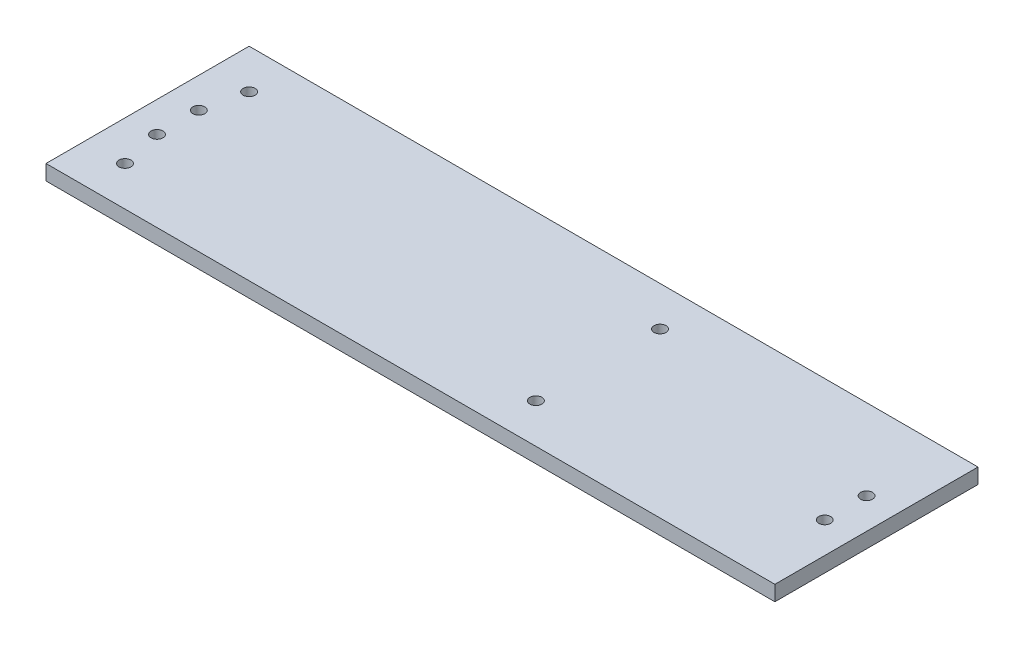
ISO-10303-21;
HEADER;
FILE_DESCRIPTION(('STEP AP214'),'2;1');
FILE_NAME('part.step','',(''),(''),'','','');
FILE_SCHEMA(('AUTOMOTIVE_DESIGN { 1 0 10303 214 1 1 1 1 }'));
ENDSEC;
DATA;
#1=APPLICATION_CONTEXT('core data for automotive mechanical design processes');
#2=APPLICATION_PROTOCOL_DEFINITION('international standard','automotive_design',2000,#1);
#3=PRODUCT_CONTEXT('',#1,'mechanical');
#4=PRODUCT('Part','Part','',(#3));
#5=PRODUCT_RELATED_PRODUCT_CATEGORY('part','',(#4));
#6=PRODUCT_DEFINITION_FORMATION('','',#4);
#7=PRODUCT_DEFINITION_CONTEXT('part definition',#1,'design');
#8=PRODUCT_DEFINITION('design','',#6,#7);
#9=PRODUCT_DEFINITION_SHAPE('','',#8);
#10=(LENGTH_UNIT() NAMED_UNIT(*) SI_UNIT(.MILLI.,.METRE.));
#11=(NAMED_UNIT(*) PLANE_ANGLE_UNIT() SI_UNIT($,.RADIAN.));
#12=(NAMED_UNIT(*) SI_UNIT($,.STERADIAN.) SOLID_ANGLE_UNIT());
#13=UNCERTAINTY_MEASURE_WITH_UNIT(LENGTH_MEASURE(1.E-05),#10,'distance_accuracy_value','');
#14=(GEOMETRIC_REPRESENTATION_CONTEXT(3) GLOBAL_UNCERTAINTY_ASSIGNED_CONTEXT((#13)) GLOBAL_UNIT_ASSIGNED_CONTEXT((#10,
#11,#12)) REPRESENTATION_CONTEXT('',''));
#15=CARTESIAN_POINT('',(0.,0.,0.));
#16=DIRECTION('',(0.,0.,1.));
#17=DIRECTION('',(1.,0.,0.));
#18=AXIS2_PLACEMENT_3D('',#15,#16,#17);
#19=CARTESIAN_POINT('',(152.5,3.175,42.5));
#20=DIRECTION('',(-1.,0.,0.));
#21=DIRECTION('',(0.,0.,1.));
#22=AXIS2_PLACEMENT_3D('',#19,#20,#21);
#23=PLANE('',#22);
#24=DIRECTION('',(0.,0.,-1.));
#25=VECTOR('',#24,1.);
#26=CARTESIAN_POINT('',(152.5,-3.175,42.5));
#27=LINE('',#26,#25);
#28=CARTESIAN_POINT('',(152.5,-3.175,42.5));
#29=VERTEX_POINT('',#28);
#30=CARTESIAN_POINT('',(152.5,-3.175,-42.5));
#31=VERTEX_POINT('',#30);
#32=EDGE_CURVE('E104',#29,#31,#27,.T.);
#33=ORIENTED_EDGE('',*,*,#32,.T.);
#34=DIRECTION('',(0.,-1.,0.));
#35=VECTOR('',#34,1.);
#36=CARTESIAN_POINT('',(152.5,3.175,-42.5));
#37=LINE('',#36,#35);
#38=CARTESIAN_POINT('',(152.5,3.175,-42.5));
#39=VERTEX_POINT('',#38);
#40=EDGE_CURVE('E11',#39,#31,#37,.T.);
#41=ORIENTED_EDGE('',*,*,#40,.F.);
#42=DIRECTION('',(0.,0.,-1.));
#43=VECTOR('',#42,1.);
#44=CARTESIAN_POINT('',(152.5,3.175,42.5));
#45=LINE('',#44,#43);
#46=CARTESIAN_POINT('',(152.5,3.175,42.5));
#47=VERTEX_POINT('',#46);
#48=EDGE_CURVE('E91',#47,#39,#45,.T.);
#49=ORIENTED_EDGE('',*,*,#48,.F.);
#50=DIRECTION('',(0.,-1.,0.));
#51=VECTOR('',#50,1.);
#52=CARTESIAN_POINT('',(152.5,3.175,42.5));
#53=LINE('',#52,#51);
#54=EDGE_CURVE('E100',#47,#29,#53,.T.);
#55=ORIENTED_EDGE('',*,*,#54,.T.);
#56=EDGE_LOOP('',(#33,#41,#49,#55));
#57=FACE_BOUND('',#56,.T.);
#58=ADVANCED_FACE('F38',(#57),#23,.F.);
#59=CARTESIAN_POINT('',(-152.5,3.175,-42.5));
#60=DIRECTION('',(0.,0.,1.));
#61=DIRECTION('',(1.,0.,0.));
#62=AXIS2_PLACEMENT_3D('',#59,#60,#61);
#63=PLANE('',#62);
#64=DIRECTION('',(-1.,0.,0.));
#65=VECTOR('',#64,1.);
#66=CARTESIAN_POINT('',(-152.5,-3.175,-42.5));
#67=LINE('',#66,#65);
#68=CARTESIAN_POINT('',(-152.5,-3.175,-42.5));
#69=VERTEX_POINT('',#68);
#70=EDGE_CURVE('E95',#31,#69,#67,.T.);
#71=ORIENTED_EDGE('',*,*,#70,.T.);
#72=DIRECTION('',(0.,-1.,0.));
#73=VECTOR('',#72,1.);
#74=CARTESIAN_POINT('',(-152.5,3.175,-42.5));
#75=LINE('',#74,#73);
#76=CARTESIAN_POINT('',(-152.5,3.175,-42.5));
#77=VERTEX_POINT('',#76);
#78=EDGE_CURVE('E47',#77,#69,#75,.T.);
#79=ORIENTED_EDGE('',*,*,#78,.F.);
#80=DIRECTION('',(-1.,0.,0.));
#81=VECTOR('',#80,1.);
#82=CARTESIAN_POINT('',(-152.5,3.175,-42.5));
#83=LINE('',#82,#81);
#84=EDGE_CURVE('E86',#39,#77,#83,.T.);
#85=ORIENTED_EDGE('',*,*,#84,.F.);
#86=ORIENTED_EDGE('',*,*,#40,.T.);
#87=EDGE_LOOP('',(#71,#79,#85,#86));
#88=FACE_BOUND('',#87,.T.);
#89=ADVANCED_FACE('F94',(#88),#63,.F.);
#90=CARTESIAN_POINT('',(-152.5,3.175,42.5));
#91=DIRECTION('',(1.,0.,0.));
#92=DIRECTION('',(0.,0.,-1.));
#93=AXIS2_PLACEMENT_3D('',#90,#91,#92);
#94=PLANE('',#93);
#95=DIRECTION('',(0.,0.,1.));
#96=VECTOR('',#95,1.);
#97=CARTESIAN_POINT('',(-152.5,-3.175,42.5));
#98=LINE('',#97,#96);
#99=CARTESIAN_POINT('',(-152.5,-3.175,42.5));
#100=VERTEX_POINT('',#99);
#101=EDGE_CURVE('E73',#69,#100,#98,.T.);
#102=ORIENTED_EDGE('',*,*,#101,.T.);
#103=DIRECTION('',(0.,-1.,0.));
#104=VECTOR('',#103,1.);
#105=CARTESIAN_POINT('',(-152.5,3.175,42.5));
#106=LINE('',#105,#104);
#107=CARTESIAN_POINT('',(-152.5,3.175,42.5));
#108=VERTEX_POINT('',#107);
#109=EDGE_CURVE('E96',#108,#100,#106,.T.);
#110=ORIENTED_EDGE('',*,*,#109,.F.);
#111=DIRECTION('',(0.,0.,1.));
#112=VECTOR('',#111,1.);
#113=CARTESIAN_POINT('',(-152.5,3.175,42.5));
#114=LINE('',#113,#112);
#115=EDGE_CURVE('E89',#77,#108,#114,.T.);
#116=ORIENTED_EDGE('',*,*,#115,.F.);
#117=ORIENTED_EDGE('',*,*,#78,.T.);
#118=EDGE_LOOP('',(#102,#110,#116,#117));
#119=FACE_BOUND('',#118,.T.);
#120=ADVANCED_FACE('F98',(#119),#94,.F.);
#121=CARTESIAN_POINT('',(-152.5,3.175,42.5));
#122=DIRECTION('',(0.,0.,-1.));
#123=DIRECTION('',(-1.,0.,0.));
#124=AXIS2_PLACEMENT_3D('',#121,#122,#123);
#125=PLANE('',#124);
#126=DIRECTION('',(1.,0.,0.));
#127=VECTOR('',#126,1.);
#128=CARTESIAN_POINT('',(-152.5,-3.175,42.5));
#129=LINE('',#128,#127);
#130=EDGE_CURVE('E79',#100,#29,#129,.T.);
#131=ORIENTED_EDGE('',*,*,#130,.T.);
#132=ORIENTED_EDGE('',*,*,#54,.F.);
#133=DIRECTION('',(1.,0.,0.));
#134=VECTOR('',#133,1.);
#135=CARTESIAN_POINT('',(-152.5,3.175,42.5));
#136=LINE('',#135,#134);
#137=EDGE_CURVE('E56',#108,#47,#136,.T.);
#138=ORIENTED_EDGE('',*,*,#137,.F.);
#139=ORIENTED_EDGE('',*,*,#109,.T.);
#140=EDGE_LOOP('',(#131,#132,#138,#139));
#141=FACE_BOUND('',#140,.T.);
#142=ADVANCED_FACE('F177',(#141),#125,.F.);
#143=CARTESIAN_POINT('',(0.,3.175,0.));
#144=DIRECTION('',(0.,-1.,0.));
#145=DIRECTION('',(0.,0.,-1.));
#146=AXIS2_PLACEMENT_3D('',#143,#144,#145);
#147=PLANE('',#146);
#148=CARTESIAN_POINT('',(139.600000000001,3.175,-8.74999999999215));
#149=DIRECTION('',(0.,-1.,0.));
#150=DIRECTION('',(0.,0.,-1.));
#151=AXIS2_PLACEMENT_3D('',#148,#149,#150);
#152=CIRCLE('',#151,2.49999999999789);
#153=CARTESIAN_POINT('',(139.600000000001,3.175,-11.24999999999));
#154=VERTEX_POINT('',#153);
#155=EDGE_CURVE('E114',#154,#154,#152,.T.);
#156=ORIENTED_EDGE('',*,*,#155,.T.);
#157=EDGE_LOOP('',(#156));
#158=FACE_BOUND('',#157,.T.);
#159=CARTESIAN_POINT('',(139.600000000001,3.175,8.75000000000787));
#160=DIRECTION('',(0.,-1.,0.));
#161=DIRECTION('',(0.,0.,-1.));
#162=AXIS2_PLACEMENT_3D('',#159,#160,#161);
#163=CIRCLE('',#162,2.49999999999789);
#164=CARTESIAN_POINT('',(139.600000000001,3.175,6.25000000000998));
#165=VERTEX_POINT('',#164);
#166=EDGE_CURVE('E120',#165,#165,#163,.T.);
#167=ORIENTED_EDGE('',*,*,#166,.T.);
#168=EDGE_LOOP('',(#167));
#169=FACE_BOUND('',#168,.T.);
#170=CARTESIAN_POINT('',(-139.8,3.175,-8.75));
#171=DIRECTION('',(0.,-1.,0.));
#172=DIRECTION('',(0.,0.,-1.));
#173=AXIS2_PLACEMENT_3D('',#170,#171,#172);
#174=CIRCLE('',#173,2.5);
#175=CARTESIAN_POINT('',(-139.8,3.175,-11.25));
#176=VERTEX_POINT('',#175);
#177=EDGE_CURVE('E135',#176,#176,#174,.T.);
#178=ORIENTED_EDGE('',*,*,#177,.T.);
#179=EDGE_LOOP('',(#178));
#180=FACE_BOUND('',#179,.T.);
#181=CARTESIAN_POINT('',(-139.8,3.175,8.75));
#182=DIRECTION('',(0.,-1.,0.));
#183=DIRECTION('',(0.,0.,-1.));
#184=AXIS2_PLACEMENT_3D('',#181,#182,#183);
#185=CIRCLE('',#184,2.5);
#186=CARTESIAN_POINT('',(-139.8,3.175,6.25));
#187=VERTEX_POINT('',#186);
#188=EDGE_CURVE('E130',#187,#187,#185,.T.);
#189=ORIENTED_EDGE('',*,*,#188,.T.);
#190=EDGE_LOOP('',(#189));
#191=FACE_BOUND('',#190,.T.);
#192=CARTESIAN_POINT('',(35.98,3.175,25.98));
#193=DIRECTION('',(0.,1.,0.));
#194=DIRECTION('',(0.,0.,-1.));
#195=AXIS2_PLACEMENT_3D('',#192,#193,#194);
#196=CIRCLE('',#195,2.50000000000011);
#197=CARTESIAN_POINT('',(35.98,3.175,23.4799999999999));
#198=VERTEX_POINT('',#197);
#199=EDGE_CURVE('E142',#198,#198,#196,.T.);
#200=ORIENTED_EDGE('',*,*,#199,.F.);
#201=EDGE_LOOP('',(#200));
#202=FACE_BOUND('',#201,.T.);
#203=CARTESIAN_POINT('',(35.98,3.175,-25.98));
#204=DIRECTION('',(0.,1.,0.));
#205=DIRECTION('',(0.,0.,1.));
#206=AXIS2_PLACEMENT_3D('',#203,#204,#205);
#207=CIRCLE('',#206,2.50000000000011);
#208=CARTESIAN_POINT('',(35.98,3.175,-23.4799999999999));
#209=VERTEX_POINT('',#208);
#210=EDGE_CURVE('E143',#209,#209,#207,.T.);
#211=ORIENTED_EDGE('',*,*,#210,.F.);
#212=EDGE_LOOP('',(#211));
#213=FACE_BOUND('',#212,.T.);
#214=CARTESIAN_POINT('',(-135.98,3.175,25.98));
#215=DIRECTION('',(0.,-1.,0.));
#216=DIRECTION('',(0.,0.,-1.));
#217=AXIS2_PLACEMENT_3D('',#214,#215,#216);
#218=CIRCLE('',#217,2.50000000000011);
#219=CARTESIAN_POINT('',(-135.98,3.175,23.4799999999999));
#220=VERTEX_POINT('',#219);
#221=EDGE_CURVE('E107',#220,#220,#218,.T.);
#222=ORIENTED_EDGE('',*,*,#221,.T.);
#223=EDGE_LOOP('',(#222));
#224=FACE_BOUND('',#223,.T.);
#225=CARTESIAN_POINT('',(-135.98,3.175,-25.98));
#226=DIRECTION('',(0.,-1.,0.));
#227=DIRECTION('',(0.,0.,1.));
#228=AXIS2_PLACEMENT_3D('',#225,#226,#227);
#229=CIRCLE('',#228,2.50000000000011);
#230=CARTESIAN_POINT('',(-135.98,3.175,-23.4799999999999));
#231=VERTEX_POINT('',#230);
#232=EDGE_CURVE('E154',#231,#231,#229,.T.);
#233=ORIENTED_EDGE('',*,*,#232,.T.);
#234=EDGE_LOOP('',(#233));
#235=FACE_BOUND('',#234,.T.);
#236=ORIENTED_EDGE('',*,*,#48,.T.);
#237=ORIENTED_EDGE('',*,*,#84,.T.);
#238=ORIENTED_EDGE('',*,*,#115,.T.);
#239=ORIENTED_EDGE('',*,*,#137,.T.);
#240=EDGE_LOOP('',(#236,#237,#238,#239));
#241=FACE_BOUND('',#240,.T.);
#242=ADVANCED_FACE('F87',(#158,#169,#180,#191,#202,#213,#224,#235,#241),#147,.F.);
#243=CARTESIAN_POINT('',(0.,-3.175,0.));
#244=DIRECTION('',(0.,-1.,0.));
#245=DIRECTION('',(0.,0.,-1.));
#246=AXIS2_PLACEMENT_3D('',#243,#244,#245);
#247=PLANE('',#246);
#248=CARTESIAN_POINT('',(139.600000000001,-3.175,-8.74999999999215));
#249=DIRECTION('',(0.,-1.,0.));
#250=DIRECTION('',(0.,0.,-1.));
#251=AXIS2_PLACEMENT_3D('',#248,#249,#250);
#252=CIRCLE('',#251,2.49999999999789);
#253=CARTESIAN_POINT('',(139.600000000001,-3.175,-11.24999999999));
#254=VERTEX_POINT('',#253);
#255=EDGE_CURVE('E41',#254,#254,#252,.T.);
#256=ORIENTED_EDGE('',*,*,#255,.F.);
#257=EDGE_LOOP('',(#256));
#258=FACE_BOUND('',#257,.T.);
#259=CARTESIAN_POINT('',(139.600000000001,-3.175,8.75000000000787));
#260=DIRECTION('',(0.,-1.,0.));
#261=DIRECTION('',(0.,0.,-1.));
#262=AXIS2_PLACEMENT_3D('',#259,#260,#261);
#263=CIRCLE('',#262,2.49999999999789);
#264=CARTESIAN_POINT('',(139.600000000001,-3.175,6.25000000000998));
#265=VERTEX_POINT('',#264);
#266=EDGE_CURVE('E112',#265,#265,#263,.T.);
#267=ORIENTED_EDGE('',*,*,#266,.F.);
#268=EDGE_LOOP('',(#267));
#269=FACE_BOUND('',#268,.T.);
#270=CARTESIAN_POINT('',(-139.8,-3.175,-8.75));
#271=DIRECTION('',(0.,1.,0.));
#272=DIRECTION('',(0.,0.,1.));
#273=AXIS2_PLACEMENT_3D('',#270,#271,#272);
#274=CIRCLE('',#273,2.5);
#275=CARTESIAN_POINT('',(-139.8,-3.175,-6.25000000000001));
#276=VERTEX_POINT('',#275);
#277=EDGE_CURVE('E127',#276,#276,#274,.T.);
#278=ORIENTED_EDGE('',*,*,#277,.T.);
#279=EDGE_LOOP('',(#278));
#280=FACE_BOUND('',#279,.T.);
#281=CARTESIAN_POINT('',(-139.8,-3.175,8.75));
#282=DIRECTION('',(0.,1.,0.));
#283=DIRECTION('',(0.,0.,1.));
#284=AXIS2_PLACEMENT_3D('',#281,#282,#283);
#285=CIRCLE('',#284,2.5);
#286=CARTESIAN_POINT('',(-139.8,-3.175,11.25));
#287=VERTEX_POINT('',#286);
#288=EDGE_CURVE('E118',#287,#287,#285,.T.);
#289=ORIENTED_EDGE('',*,*,#288,.T.);
#290=EDGE_LOOP('',(#289));
#291=FACE_BOUND('',#290,.T.);
#292=CARTESIAN_POINT('',(35.98,-3.175,25.98));
#293=DIRECTION('',(0.,1.,0.));
#294=DIRECTION('',(0.,0.,-1.));
#295=AXIS2_PLACEMENT_3D('',#292,#293,#294);
#296=CIRCLE('',#295,2.50000000000011);
#297=CARTESIAN_POINT('',(35.98,-3.175,23.4799999999999));
#298=VERTEX_POINT('',#297);
#299=EDGE_CURVE('E139',#298,#298,#296,.T.);
#300=ORIENTED_EDGE('',*,*,#299,.T.);
#301=EDGE_LOOP('',(#300));
#302=FACE_BOUND('',#301,.T.);
#303=CARTESIAN_POINT('',(35.98,-3.175,-25.98));
#304=DIRECTION('',(0.,1.,0.));
#305=DIRECTION('',(0.,0.,1.));
#306=AXIS2_PLACEMENT_3D('',#303,#304,#305);
#307=CIRCLE('',#306,2.50000000000011);
#308=CARTESIAN_POINT('',(35.98,-3.175,-23.4799999999999));
#309=VERTEX_POINT('',#308);
#310=EDGE_CURVE('E138',#309,#309,#307,.T.);
#311=ORIENTED_EDGE('',*,*,#310,.T.);
#312=EDGE_LOOP('',(#311));
#313=FACE_BOUND('',#312,.T.);
#314=CARTESIAN_POINT('',(-135.98,-3.175,25.98));
#315=DIRECTION('',(0.,-1.,0.));
#316=DIRECTION('',(0.,0.,-1.));
#317=AXIS2_PLACEMENT_3D('',#314,#315,#316);
#318=CIRCLE('',#317,2.50000000000011);
#319=CARTESIAN_POINT('',(-135.98,-3.175,23.4799999999999));
#320=VERTEX_POINT('',#319);
#321=EDGE_CURVE('E151',#320,#320,#318,.T.);
#322=ORIENTED_EDGE('',*,*,#321,.F.);
#323=EDGE_LOOP('',(#322));
#324=FACE_BOUND('',#323,.T.);
#325=CARTESIAN_POINT('',(-135.98,-3.175,-25.98));
#326=DIRECTION('',(0.,-1.,0.));
#327=DIRECTION('',(0.,0.,1.));
#328=AXIS2_PLACEMENT_3D('',#325,#326,#327);
#329=CIRCLE('',#328,2.50000000000011);
#330=CARTESIAN_POINT('',(-135.98,-3.175,-23.4799999999999));
#331=VERTEX_POINT('',#330);
#332=EDGE_CURVE('E146',#331,#331,#329,.T.);
#333=ORIENTED_EDGE('',*,*,#332,.F.);
#334=EDGE_LOOP('',(#333));
#335=FACE_BOUND('',#334,.T.);
#336=ORIENTED_EDGE('',*,*,#32,.F.);
#337=ORIENTED_EDGE('',*,*,#130,.F.);
#338=ORIENTED_EDGE('',*,*,#101,.F.);
#339=ORIENTED_EDGE('',*,*,#70,.F.);
#340=EDGE_LOOP('',(#336,#337,#338,#339));
#341=FACE_BOUND('',#340,.T.);
#342=ADVANCED_FACE('F167',(#258,#269,#280,#291,#302,#313,#324,#335,#341),#247,.T.);
#343=CARTESIAN_POINT('',(-135.98,3.175,-25.98));
#344=DIRECTION('',(0.,-1.,0.));
#345=DIRECTION('',(0.,0.,-1.));
#346=AXIS2_PLACEMENT_3D('',#343,#344,#345);
#347=CYLINDRICAL_SURFACE('',#346,2.50000000000011);
#348=ORIENTED_EDGE('',*,*,#232,.F.);
#349=EDGE_LOOP('',(#348));
#350=FACE_BOUND('',#349,.T.);
#351=ORIENTED_EDGE('',*,*,#332,.T.);
#352=EDGE_LOOP('',(#351));
#353=FACE_BOUND('',#352,.T.);
#354=ADVANCED_FACE('F163',(#350,#353),#347,.F.);
#355=CARTESIAN_POINT('',(-135.98,3.175,25.98));
#356=DIRECTION('',(0.,-1.,0.));
#357=DIRECTION('',(0.,0.,-1.));
#358=AXIS2_PLACEMENT_3D('',#355,#356,#357);
#359=CYLINDRICAL_SURFACE('',#358,2.50000000000011);
#360=ORIENTED_EDGE('',*,*,#221,.F.);
#361=EDGE_LOOP('',(#360));
#362=FACE_BOUND('',#361,.T.);
#363=ORIENTED_EDGE('',*,*,#321,.T.);
#364=EDGE_LOOP('',(#363));
#365=FACE_BOUND('',#364,.T.);
#366=ADVANCED_FACE('F166',(#362,#365),#359,.F.);
#367=CARTESIAN_POINT('',(35.98,3.175,-25.98));
#368=DIRECTION('',(0.,-1.,0.));
#369=DIRECTION('',(0.,0.,-1.));
#370=AXIS2_PLACEMENT_3D('',#367,#368,#369);
#371=CYLINDRICAL_SURFACE('',#370,2.50000000000011);
#372=ORIENTED_EDGE('',*,*,#210,.T.);
#373=EDGE_LOOP('',(#372));
#374=FACE_BOUND('',#373,.T.);
#375=ORIENTED_EDGE('',*,*,#310,.F.);
#376=EDGE_LOOP('',(#375));
#377=FACE_BOUND('',#376,.T.);
#378=ADVANCED_FACE('F217',(#374,#377),#371,.F.);
#379=CARTESIAN_POINT('',(35.98,3.175,25.98));
#380=DIRECTION('',(0.,-1.,0.));
#381=DIRECTION('',(0.,0.,-1.));
#382=AXIS2_PLACEMENT_3D('',#379,#380,#381);
#383=CYLINDRICAL_SURFACE('',#382,2.50000000000011);
#384=ORIENTED_EDGE('',*,*,#199,.T.);
#385=EDGE_LOOP('',(#384));
#386=FACE_BOUND('',#385,.T.);
#387=ORIENTED_EDGE('',*,*,#299,.F.);
#388=EDGE_LOOP('',(#387));
#389=FACE_BOUND('',#388,.T.);
#390=ADVANCED_FACE('F228',(#386,#389),#383,.F.);
#391=CARTESIAN_POINT('',(-139.8,-3.175,8.75));
#392=DIRECTION('',(0.,1.,0.));
#393=DIRECTION('',(0.,0.,1.));
#394=AXIS2_PLACEMENT_3D('',#391,#392,#393);
#395=CYLINDRICAL_SURFACE('',#394,2.5);
#396=ORIENTED_EDGE('',*,*,#288,.F.);
#397=EDGE_LOOP('',(#396));
#398=FACE_BOUND('',#397,.T.);
#399=ORIENTED_EDGE('',*,*,#188,.F.);
#400=EDGE_LOOP('',(#399));
#401=FACE_BOUND('',#400,.T.);
#402=ADVANCED_FACE('F239',(#398,#401),#395,.F.);
#403=CARTESIAN_POINT('',(-139.8,-3.175,-8.75));
#404=DIRECTION('',(0.,1.,0.));
#405=DIRECTION('',(0.,0.,1.));
#406=AXIS2_PLACEMENT_3D('',#403,#404,#405);
#407=CYLINDRICAL_SURFACE('',#406,2.5);
#408=ORIENTED_EDGE('',*,*,#277,.F.);
#409=EDGE_LOOP('',(#408));
#410=FACE_BOUND('',#409,.T.);
#411=ORIENTED_EDGE('',*,*,#177,.F.);
#412=EDGE_LOOP('',(#411));
#413=FACE_BOUND('',#412,.T.);
#414=ADVANCED_FACE('F250',(#410,#413),#407,.F.);
#415=CARTESIAN_POINT('',(139.600000000001,3.175,8.75000000000787));
#416=DIRECTION('',(0.,-1.,0.));
#417=DIRECTION('',(0.,0.,-1.));
#418=AXIS2_PLACEMENT_3D('',#415,#416,#417);
#419=CYLINDRICAL_SURFACE('',#418,2.49999999999789);
#420=ORIENTED_EDGE('',*,*,#266,.T.);
#421=EDGE_LOOP('',(#420));
#422=FACE_BOUND('',#421,.T.);
#423=ORIENTED_EDGE('',*,*,#166,.F.);
#424=EDGE_LOOP('',(#423));
#425=FACE_BOUND('',#424,.T.);
#426=ADVANCED_FACE('F260',(#422,#425),#419,.F.);
#427=CARTESIAN_POINT('',(139.600000000001,3.175,-8.74999999999215));
#428=DIRECTION('',(0.,-1.,0.));
#429=DIRECTION('',(0.,0.,-1.));
#430=AXIS2_PLACEMENT_3D('',#427,#428,#429);
#431=CYLINDRICAL_SURFACE('',#430,2.49999999999789);
#432=ORIENTED_EDGE('',*,*,#255,.T.);
#433=EDGE_LOOP('',(#432));
#434=FACE_BOUND('',#433,.T.);
#435=ORIENTED_EDGE('',*,*,#155,.F.);
#436=EDGE_LOOP('',(#435));
#437=FACE_BOUND('',#436,.T.);
#438=ADVANCED_FACE('F280',(#434,#437),#431,.F.);
#439=CLOSED_SHELL('',(#58,#89,#120,#142,#242,#342,#354,#366,#378,#390,#402,#414,#426,#438));
#440=MANIFOLD_SOLID_BREP('B2',#439);
#441=ADVANCED_BREP_SHAPE_REPRESENTATION('',(#18,#440),#14);
#442=SHAPE_DEFINITION_REPRESENTATION(#9,#441);
ENDSEC;
END-ISO-10303-21;
